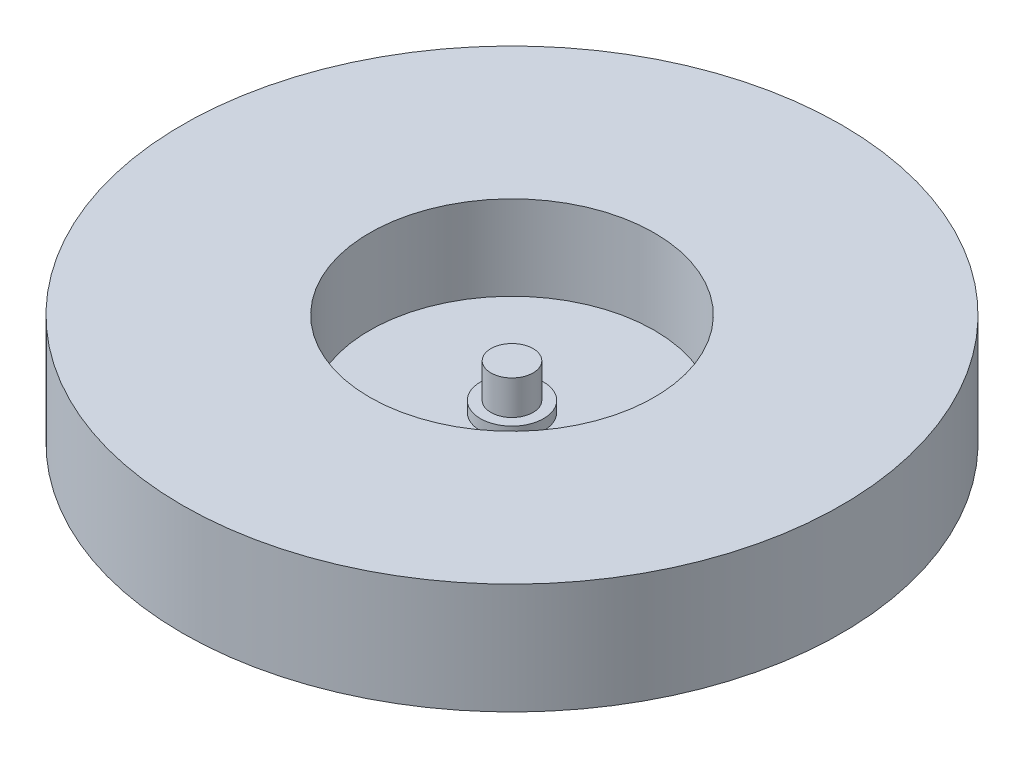
ISO-10303-21;
HEADER;
FILE_DESCRIPTION(('STEP AP214'),'2;1');
FILE_NAME('part.step','',(''),(''),'','','');
FILE_SCHEMA(('AUTOMOTIVE_DESIGN { 1 0 10303 214 1 1 1 1 }'));
ENDSEC;
DATA;
#1=APPLICATION_CONTEXT('core data for automotive mechanical design processes');
#2=APPLICATION_PROTOCOL_DEFINITION('international standard','automotive_design',2000,#1);
#3=PRODUCT_CONTEXT('',#1,'mechanical');
#4=PRODUCT('Part','Part','',(#3));
#5=PRODUCT_RELATED_PRODUCT_CATEGORY('part','',(#4));
#6=PRODUCT_DEFINITION_FORMATION('','',#4);
#7=PRODUCT_DEFINITION_CONTEXT('part definition',#1,'design');
#8=PRODUCT_DEFINITION('design','',#6,#7);
#9=PRODUCT_DEFINITION_SHAPE('','',#8);
#10=(LENGTH_UNIT() NAMED_UNIT(*) SI_UNIT(.MILLI.,.METRE.));
#11=(NAMED_UNIT(*) PLANE_ANGLE_UNIT() SI_UNIT($,.RADIAN.));
#12=(NAMED_UNIT(*) SI_UNIT($,.STERADIAN.) SOLID_ANGLE_UNIT());
#13=UNCERTAINTY_MEASURE_WITH_UNIT(LENGTH_MEASURE(1.E-05),#10,'distance_accuracy_value','');
#14=(GEOMETRIC_REPRESENTATION_CONTEXT(3) GLOBAL_UNCERTAINTY_ASSIGNED_CONTEXT((#13)) GLOBAL_UNIT_ASSIGNED_CONTEXT((#10,
#11,#12)) REPRESENTATION_CONTEXT('',''));
#15=CARTESIAN_POINT('',(0.,0.,0.));
#16=DIRECTION('',(0.,0.,1.));
#17=DIRECTION('',(1.,0.,0.));
#18=AXIS2_PLACEMENT_3D('',#15,#16,#17);
#19=CARTESIAN_POINT('',(0.,7.,0.));
#20=DIRECTION('',(0.,1.,0.));
#21=DIRECTION('',(0.,0.,1.));
#22=AXIS2_PLACEMENT_3D('',#19,#20,#21);
#23=CYLINDRICAL_SURFACE('',#22,4.);
#24=CARTESIAN_POINT('',(0.,7.,0.));
#25=DIRECTION('',(0.,1.,0.));
#26=DIRECTION('',(0.,0.,1.));
#27=AXIS2_PLACEMENT_3D('',#24,#25,#26);
#28=CIRCLE('',#27,4.);
#29=CARTESIAN_POINT('',(0.,7.,4.));
#30=VERTEX_POINT('',#29);
#31=EDGE_CURVE('E60',#30,#30,#28,.T.);
#32=CARTESIAN_POINT('',(0.,13.5,0.));
#33=DIRECTION('',(0.,1.,0.));
#34=DIRECTION('',(0.,0.,1.));
#35=AXIS2_PLACEMENT_3D('',#32,#33,#34);
#36=CIRCLE('',#35,4.);
#37=CARTESIAN_POINT('',(0.,13.5,4.));
#38=VERTEX_POINT('',#37);
#39=EDGE_CURVE('E63',#38,#38,#36,.T.);
#40=CARTESIAN_POINT('',(0.,7.,4.));
#41=CARTESIAN_POINT('',(0.,7.06770833333334,4.));
#42=CARTESIAN_POINT('',(0.,7.13541666666667,4.));
#43=CARTESIAN_POINT('',(0.,7.27083333333334,4.));
#44=CARTESIAN_POINT('',(0.,7.33854166666667,4.));
#45=CARTESIAN_POINT('',(0.,7.47395833333334,4.));
#46=CARTESIAN_POINT('',(0.,7.54166666666667,4.));
#47=CARTESIAN_POINT('',(0.,7.67708333333333,4.));
#48=CARTESIAN_POINT('',(0.,7.74479166666667,4.));
#49=CARTESIAN_POINT('',(0.,7.88020833333333,4.));
#50=CARTESIAN_POINT('',(0.,7.94791666666667,4.));
#51=CARTESIAN_POINT('',(0.,8.08333333333333,4.));
#52=CARTESIAN_POINT('',(0.,8.15104166666667,4.));
#53=CARTESIAN_POINT('',(0.,8.28645833333334,4.));
#54=CARTESIAN_POINT('',(0.,8.35416666666667,4.));
#55=CARTESIAN_POINT('',(0.,8.48958333333334,4.));
#56=CARTESIAN_POINT('',(0.,8.55729166666667,4.));
#57=CARTESIAN_POINT('',(0.,8.69270833333334,4.));
#58=CARTESIAN_POINT('',(0.,8.76041666666667,4.));
#59=CARTESIAN_POINT('',(0.,8.89583333333334,4.));
#60=CARTESIAN_POINT('',(0.,8.96354166666667,4.));
#61=CARTESIAN_POINT('',(0.,9.09895833333333,4.));
#62=CARTESIAN_POINT('',(0.,9.16666666666667,4.));
#63=CARTESIAN_POINT('',(0.,9.30208333333333,4.));
#64=CARTESIAN_POINT('',(0.,9.36979166666667,4.));
#65=CARTESIAN_POINT('',(0.,9.50520833333333,4.));
#66=CARTESIAN_POINT('',(0.,9.57291666666667,4.));
#67=CARTESIAN_POINT('',(0.,9.70833333333333,4.));
#68=CARTESIAN_POINT('',(0.,9.77604166666667,4.));
#69=CARTESIAN_POINT('',(0.,9.91145833333333,4.));
#70=CARTESIAN_POINT('',(0.,9.97916666666667,4.));
#71=CARTESIAN_POINT('',(0.,10.1145833333333,4.));
#72=CARTESIAN_POINT('',(0.,10.1822916666667,4.));
#73=CARTESIAN_POINT('',(0.,10.3177083333333,4.));
#74=CARTESIAN_POINT('',(0.,10.3854166666667,4.));
#75=CARTESIAN_POINT('',(0.,10.5208333333333,4.));
#76=CARTESIAN_POINT('',(0.,10.5885416666667,4.));
#77=CARTESIAN_POINT('',(0.,10.7239583333333,4.));
#78=CARTESIAN_POINT('',(0.,10.7916666666667,4.));
#79=CARTESIAN_POINT('',(0.,10.9270833333333,4.));
#80=CARTESIAN_POINT('',(0.,10.9947916666667,4.));
#81=CARTESIAN_POINT('',(0.,11.1302083333333,4.));
#82=CARTESIAN_POINT('',(0.,11.1979166666667,4.));
#83=CARTESIAN_POINT('',(0.,11.3333333333333,4.));
#84=CARTESIAN_POINT('',(0.,11.4010416666667,4.));
#85=CARTESIAN_POINT('',(0.,11.5364583333333,4.));
#86=CARTESIAN_POINT('',(0.,11.6041666666667,4.));
#87=CARTESIAN_POINT('',(0.,11.7395833333333,4.));
#88=CARTESIAN_POINT('',(0.,11.8072916666667,4.));
#89=CARTESIAN_POINT('',(0.,11.9427083333333,4.));
#90=CARTESIAN_POINT('',(0.,12.0104166666667,4.));
#91=CARTESIAN_POINT('',(0.,12.1458333333333,4.));
#92=CARTESIAN_POINT('',(0.,12.2135416666667,4.));
#93=CARTESIAN_POINT('',(0.,12.3489583333333,4.));
#94=CARTESIAN_POINT('',(0.,12.4166666666667,4.));
#95=CARTESIAN_POINT('',(0.,12.5520833333333,4.));
#96=CARTESIAN_POINT('',(0.,12.6197916666667,4.));
#97=CARTESIAN_POINT('',(0.,12.7552083333333,4.));
#98=CARTESIAN_POINT('',(0.,12.8229166666667,4.));
#99=CARTESIAN_POINT('',(0.,12.9583333333333,4.));
#100=CARTESIAN_POINT('',(0.,13.0260416666667,4.));
#101=CARTESIAN_POINT('',(0.,13.1614583333333,4.));
#102=CARTESIAN_POINT('',(0.,13.2291666666667,4.));
#103=CARTESIAN_POINT('',(0.,13.3645833333333,4.));
#104=CARTESIAN_POINT('',(0.,13.4322916666667,4.));
#105=CARTESIAN_POINT('',(0.,13.5,4.));
#106=B_SPLINE_CURVE_WITH_KNOTS('',3,(#40,#41,#42,#43,#44,#45,#46,#47,#48,#49,#50,#51,#52,#53,
#54,#55,#56,#57,#58,#59,#60,#61,#62,#63,#64,#65,#66,#67,#68,#69,#70,#71,#72,#73,#74,#75,#76,#77,
#78,#79,#80,#81,#82,#83,#84,#85,#86,#87,#88,#89,#90,#91,#92,#93,#94,#95,#96,#97,#98,#99,#100,
#101,#102,#103,#104,#105),.UNSPECIFIED.,.F.,.F.,(4,2,2,2,2,2,2,2,2,2,2,2,2,2,2,2,2,2,2,2,2,2,2,
2,2,2,2,2,2,2,2,2,4),(0.,0.203124999999999,0.40625,0.609375,0.812499999999999,1.015625,1.21875,
1.421875,1.625,1.828125,2.03125,2.234375,2.4375,2.640625,2.84375,3.046875,3.25,3.453125,3.65625,
3.859375,4.0625,4.265625,4.46875,4.671875,4.875,5.078125,5.28125,5.484375,5.6875,5.890625,
6.09375,6.296875,6.5),.UNSPECIFIED.);
#107=EDGE_CURVE('BSEAM36',#30,#38,#106,.T.);
#108=ORIENTED_EDGE('',*,*,#31,.T.);
#109=ORIENTED_EDGE('',*,*,#39,.F.);
#110=ORIENTED_EDGE('',*,*,#107,.T.);
#111=ORIENTED_EDGE('',*,*,#107,.F.);
#112=EDGE_LOOP('',(#108,#110,#109,#111));
#113=FACE_BOUND('',#112,.T.);
#114=ADVANCED_FACE('F36',(#113),#23,.T.);
#115=CARTESIAN_POINT('',(0.,5.,0.));
#116=DIRECTION('',(0.,1.,0.));
#117=DIRECTION('',(0.,0.,1.));
#118=AXIS2_PLACEMENT_3D('',#115,#116,#117);
#119=CYLINDRICAL_SURFACE('',#118,6.);
#120=CARTESIAN_POINT('',(0.,5.,0.));
#121=DIRECTION('',(0.,1.,0.));
#122=DIRECTION('',(0.,0.,1.));
#123=AXIS2_PLACEMENT_3D('',#120,#121,#122);
#124=CIRCLE('',#123,6.);
#125=CARTESIAN_POINT('',(0.,5.,6.));
#126=VERTEX_POINT('',#125);
#127=EDGE_CURVE('E52',#126,#126,#124,.T.);
#128=ORIENTED_EDGE('',*,*,#127,.T.);
#129=EDGE_LOOP('',(#128));
#130=FACE_BOUND('',#129,.T.);
#131=CARTESIAN_POINT('',(0.,7.,0.));
#132=DIRECTION('',(0.,1.,0.));
#133=DIRECTION('',(0.,0.,1.));
#134=AXIS2_PLACEMENT_3D('',#131,#132,#133);
#135=CIRCLE('',#134,6.);
#136=CARTESIAN_POINT('',(0.,7.,6.));
#137=VERTEX_POINT('',#136);
#138=EDGE_CURVE('E57',#137,#137,#135,.T.);
#139=ORIENTED_EDGE('',*,*,#138,.F.);
#140=EDGE_LOOP('',(#139));
#141=FACE_BOUND('',#140,.T.);
#142=ADVANCED_FACE('F70',(#130,#141),#119,.T.);
#143=CARTESIAN_POINT('',(0.,21.,0.));
#144=DIRECTION('',(0.,-1.,0.));
#145=DIRECTION('',(0.,0.,-1.));
#146=AXIS2_PLACEMENT_3D('',#143,#144,#145);
#147=CYLINDRICAL_SURFACE('',#146,62.5);
#148=CARTESIAN_POINT('',(0.,21.,0.));
#149=DIRECTION('',(0.,1.,0.));
#150=DIRECTION('',(0.,0.,1.));
#151=AXIS2_PLACEMENT_3D('',#148,#149,#150);
#152=CIRCLE('',#151,62.5);
#153=CARTESIAN_POINT('',(0.,21.,-62.5));
#154=VERTEX_POINT('',#153);
#155=EDGE_CURVE('E11',#154,#154,#152,.T.);
#156=CARTESIAN_POINT('',(0.,0.,0.));
#157=DIRECTION('',(0.,1.,0.));
#158=DIRECTION('',(0.,0.,1.));
#159=AXIS2_PLACEMENT_3D('',#156,#157,#158);
#160=CIRCLE('',#159,62.5);
#161=CARTESIAN_POINT('',(0.,0.,-62.5));
#162=VERTEX_POINT('',#161);
#163=EDGE_CURVE('E40',#162,#162,#160,.T.);
#164=CARTESIAN_POINT('',(0.,21.,-62.5));
#165=CARTESIAN_POINT('',(0.,20.78125,-62.5));
#166=CARTESIAN_POINT('',(0.,20.5625,-62.5));
#167=CARTESIAN_POINT('',(0.,20.125,-62.5));
#168=CARTESIAN_POINT('',(0.,19.90625,-62.5));
#169=CARTESIAN_POINT('',(0.,19.46875,-62.5));
#170=CARTESIAN_POINT('',(0.,19.25,-62.5));
#171=CARTESIAN_POINT('',(0.,18.8125,-62.5));
#172=CARTESIAN_POINT('',(0.,18.59375,-62.5));
#173=CARTESIAN_POINT('',(0.,18.15625,-62.5));
#174=CARTESIAN_POINT('',(0.,17.9375,-62.5));
#175=CARTESIAN_POINT('',(0.,17.5,-62.5));
#176=CARTESIAN_POINT('',(0.,17.28125,-62.5));
#177=CARTESIAN_POINT('',(0.,16.84375,-62.5));
#178=CARTESIAN_POINT('',(0.,16.625,-62.5));
#179=CARTESIAN_POINT('',(0.,16.1875,-62.5));
#180=CARTESIAN_POINT('',(0.,15.96875,-62.5));
#181=CARTESIAN_POINT('',(0.,15.53125,-62.5));
#182=CARTESIAN_POINT('',(0.,15.3125,-62.5));
#183=CARTESIAN_POINT('',(0.,14.875,-62.5));
#184=CARTESIAN_POINT('',(0.,14.65625,-62.5));
#185=CARTESIAN_POINT('',(0.,14.21875,-62.5));
#186=CARTESIAN_POINT('',(0.,14.,-62.5));
#187=CARTESIAN_POINT('',(0.,13.5625,-62.5));
#188=CARTESIAN_POINT('',(0.,13.34375,-62.5));
#189=CARTESIAN_POINT('',(0.,12.90625,-62.5));
#190=CARTESIAN_POINT('',(0.,12.6875,-62.5));
#191=CARTESIAN_POINT('',(0.,12.25,-62.5));
#192=CARTESIAN_POINT('',(0.,12.03125,-62.5));
#193=CARTESIAN_POINT('',(0.,11.59375,-62.5));
#194=CARTESIAN_POINT('',(0.,11.375,-62.5));
#195=CARTESIAN_POINT('',(0.,10.9375,-62.5));
#196=CARTESIAN_POINT('',(0.,10.71875,-62.5));
#197=CARTESIAN_POINT('',(0.,10.28125,-62.5));
#198=CARTESIAN_POINT('',(0.,10.0625,-62.5));
#199=CARTESIAN_POINT('',(0.,9.625,-62.5));
#200=CARTESIAN_POINT('',(0.,9.40625,-62.5));
#201=CARTESIAN_POINT('',(0.,8.96875,-62.5));
#202=CARTESIAN_POINT('',(0.,8.75,-62.5));
#203=CARTESIAN_POINT('',(0.,8.3125,-62.5));
#204=CARTESIAN_POINT('',(0.,8.09375,-62.5));
#205=CARTESIAN_POINT('',(0.,7.65625,-62.5));
#206=CARTESIAN_POINT('',(0.,7.4375,-62.5));
#207=CARTESIAN_POINT('',(0.,7.,-62.5));
#208=CARTESIAN_POINT('',(0.,6.78125,-62.5));
#209=CARTESIAN_POINT('',(0.,6.34375,-62.5));
#210=CARTESIAN_POINT('',(0.,6.125,-62.5));
#211=CARTESIAN_POINT('',(0.,5.6875,-62.5));
#212=CARTESIAN_POINT('',(0.,5.46875,-62.5));
#213=CARTESIAN_POINT('',(0.,5.03125,-62.5));
#214=CARTESIAN_POINT('',(0.,4.8125,-62.5));
#215=CARTESIAN_POINT('',(0.,4.375,-62.5));
#216=CARTESIAN_POINT('',(0.,4.15625,-62.5));
#217=CARTESIAN_POINT('',(0.,3.71875,-62.5));
#218=CARTESIAN_POINT('',(0.,3.5,-62.5));
#219=CARTESIAN_POINT('',(0.,3.0625,-62.5));
#220=CARTESIAN_POINT('',(0.,2.84375,-62.5));
#221=CARTESIAN_POINT('',(0.,2.40625,-62.5));
#222=CARTESIAN_POINT('',(0.,2.1875,-62.5));
#223=CARTESIAN_POINT('',(0.,1.75,-62.5));
#224=CARTESIAN_POINT('',(0.,1.53125,-62.5));
#225=CARTESIAN_POINT('',(0.,1.09375,-62.5));
#226=CARTESIAN_POINT('',(0.,0.875000000000001,-62.5));
#227=CARTESIAN_POINT('',(0.,0.4375,-62.5));
#228=CARTESIAN_POINT('',(0.,0.21875,-62.5));
#229=CARTESIAN_POINT('',(0.,0.,-62.5));
#230=B_SPLINE_CURVE_WITH_KNOTS('',3,(#164,#165,#166,#167,#168,#169,#170,#171,#172,#173,#174,
#175,#176,#177,#178,#179,#180,#181,#182,#183,#184,#185,#186,#187,#188,#189,#190,#191,#192,#193,
#194,#195,#196,#197,#198,#199,#200,#201,#202,#203,#204,#205,#206,#207,#208,#209,#210,#211,#212,
#213,#214,#215,#216,#217,#218,#219,#220,#221,#222,#223,#224,#225,#226,#227,#228,#229),
.UNSPECIFIED.,.F.,.F.,(4,2,2,2,2,2,2,2,2,2,2,2,2,2,2,2,2,2,2,2,2,2,2,2,2,2,2,2,2,2,2,2,4),(0.,
0.656250000000001,1.3125,1.96875,2.625,3.28125,3.9375,4.59375,5.25,5.90625,6.5625,7.21875,7.875,
8.53125,9.1875,9.84375,10.5,11.15625,11.8125,12.46875,13.125,13.78125,14.4375,15.09375,15.75,
16.40625,17.0625,17.71875,18.375,19.03125,19.6875,20.34375,21.),.UNSPECIFIED.);
#231=EDGE_CURVE('BSEAM38',#154,#162,#230,.T.);
#232=ORIENTED_EDGE('',*,*,#155,.F.);
#233=ORIENTED_EDGE('',*,*,#163,.T.);
#234=ORIENTED_EDGE('',*,*,#231,.T.);
#235=ORIENTED_EDGE('',*,*,#231,.F.);
#236=EDGE_LOOP('',(#232,#234,#233,#235));
#237=FACE_BOUND('',#236,.T.);
#238=ADVANCED_FACE('F38',(#237),#147,.T.);
#239=CARTESIAN_POINT('',(0.,21.,0.));
#240=DIRECTION('',(0.,1.,0.));
#241=DIRECTION('',(0.,0.,1.));
#242=AXIS2_PLACEMENT_3D('',#239,#240,#241);
#243=PLANE('',#242);
#244=CARTESIAN_POINT('',(0.,21.,0.));
#245=DIRECTION('',(0.,1.,0.));
#246=DIRECTION('',(0.,0.,1.));
#247=AXIS2_PLACEMENT_3D('',#244,#245,#246);
#248=CIRCLE('',#247,27.);
#249=CARTESIAN_POINT('',(0.,21.,27.));
#250=VERTEX_POINT('',#249);
#251=EDGE_CURVE('E49',#250,#250,#248,.T.);
#252=ORIENTED_EDGE('',*,*,#251,.F.);
#253=EDGE_LOOP('',(#252));
#254=FACE_BOUND('',#253,.T.);
#255=ORIENTED_EDGE('',*,*,#155,.T.);
#256=EDGE_LOOP('',(#255));
#257=FACE_BOUND('',#256,.T.);
#258=ADVANCED_FACE('F93',(#254,#257),#243,.T.);
#259=CARTESIAN_POINT('',(0.,0.,0.));
#260=DIRECTION('',(0.,1.,0.));
#261=DIRECTION('',(0.,0.,1.));
#262=AXIS2_PLACEMENT_3D('',#259,#260,#261);
#263=PLANE('',#262);
#264=ORIENTED_EDGE('',*,*,#163,.F.);
#265=EDGE_LOOP('',(#264));
#266=FACE_BOUND('',#265,.T.);
#267=ADVANCED_FACE('F91',(#266),#263,.F.);
#268=CARTESIAN_POINT('',(0.,5.,0.));
#269=DIRECTION('',(0.,1.,0.));
#270=DIRECTION('',(0.,0.,1.));
#271=AXIS2_PLACEMENT_3D('',#268,#269,#270);
#272=CYLINDRICAL_SURFACE('',#271,27.);
#273=CARTESIAN_POINT('',(0.,5.,0.));
#274=DIRECTION('',(0.,1.,0.));
#275=DIRECTION('',(0.,0.,1.));
#276=AXIS2_PLACEMENT_3D('',#273,#274,#275);
#277=CIRCLE('',#276,27.);
#278=CARTESIAN_POINT('',(0.,5.,27.));
#279=VERTEX_POINT('',#278);
#280=EDGE_CURVE('E47',#279,#279,#277,.T.);
#281=ORIENTED_EDGE('',*,*,#280,.F.);
#282=EDGE_LOOP('',(#281));
#283=FACE_BOUND('',#282,.T.);
#284=ORIENTED_EDGE('',*,*,#251,.T.);
#285=EDGE_LOOP('',(#284));
#286=FACE_BOUND('',#285,.T.);
#287=ADVANCED_FACE('F87',(#283,#286),#272,.F.);
#288=CARTESIAN_POINT('',(0.,5.,0.));
#289=DIRECTION('',(0.,1.,0.));
#290=DIRECTION('',(0.,0.,1.));
#291=AXIS2_PLACEMENT_3D('',#288,#289,#290);
#292=PLANE('',#291);
#293=ORIENTED_EDGE('',*,*,#127,.F.);
#294=EDGE_LOOP('',(#293));
#295=FACE_BOUND('',#294,.T.);
#296=ORIENTED_EDGE('',*,*,#280,.T.);
#297=EDGE_LOOP('',(#296));
#298=FACE_BOUND('',#297,.T.);
#299=ADVANCED_FACE('F82',(#295,#298),#292,.T.);
#300=CARTESIAN_POINT('',(0.,7.,0.));
#301=DIRECTION('',(0.,1.,0.));
#302=DIRECTION('',(0.,0.,1.));
#303=AXIS2_PLACEMENT_3D('',#300,#301,#302);
#304=PLANE('',#303);
#305=ORIENTED_EDGE('',*,*,#31,.F.);
#306=EDGE_LOOP('',(#305));
#307=FACE_BOUND('',#306,.T.);
#308=ORIENTED_EDGE('',*,*,#138,.T.);
#309=EDGE_LOOP('',(#308));
#310=FACE_BOUND('',#309,.T.);
#311=ADVANCED_FACE('F80',(#307,#310),#304,.T.);
#312=CARTESIAN_POINT('',(0.,13.5,0.));
#313=DIRECTION('',(0.,1.,0.));
#314=DIRECTION('',(0.,0.,1.));
#315=AXIS2_PLACEMENT_3D('',#312,#313,#314);
#316=PLANE('',#315);
#317=ORIENTED_EDGE('',*,*,#39,.T.);
#318=EDGE_LOOP('',(#317));
#319=FACE_BOUND('',#318,.T.);
#320=ADVANCED_FACE('F67',(#319),#316,.T.);
#321=CLOSED_SHELL('',(#114,#142,#238,#258,#267,#287,#299,#311,#320));
#322=MANIFOLD_SOLID_BREP('B2',#321);
#323=ADVANCED_BREP_SHAPE_REPRESENTATION('',(#18,#322),#14);
#324=SHAPE_DEFINITION_REPRESENTATION(#9,#323);
ENDSEC;
END-ISO-10303-21;
